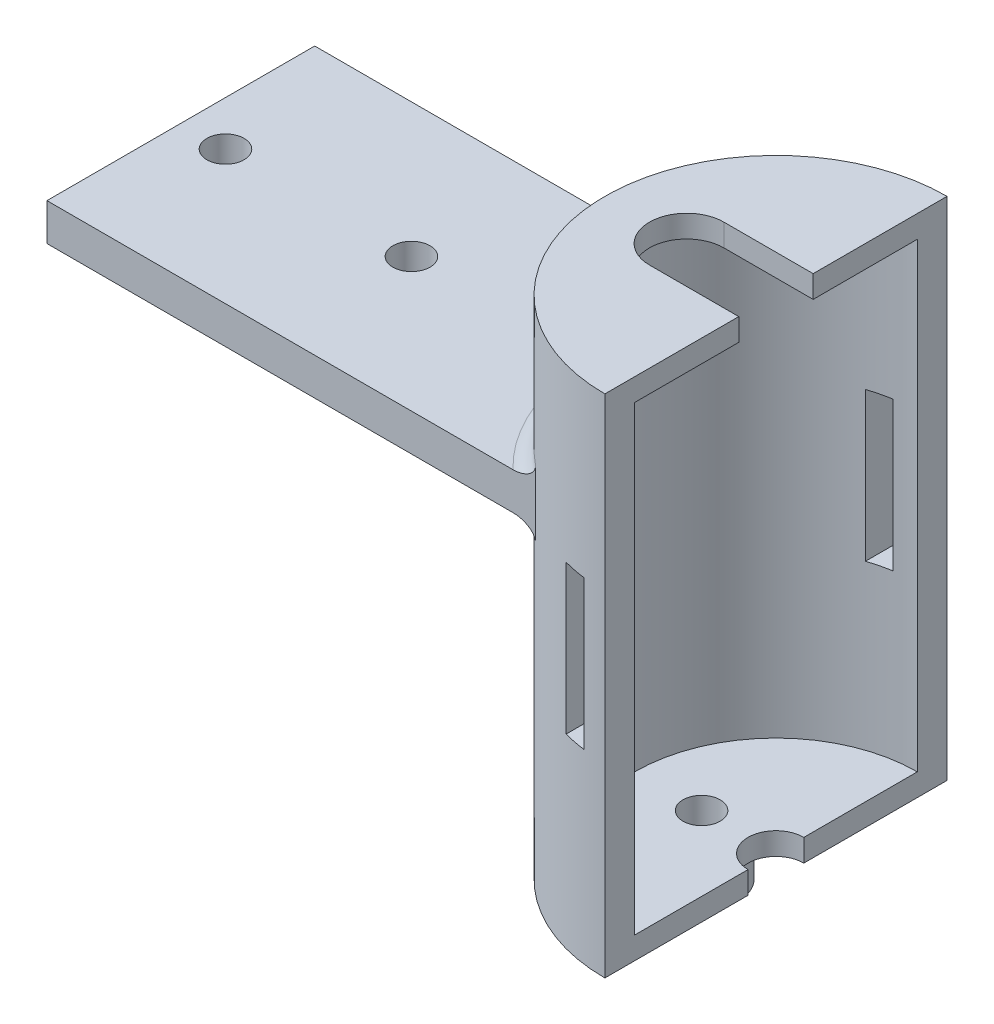
ISO-10303-21;
HEADER;
FILE_DESCRIPTION(('STEP AP214'),'2;1');
FILE_NAME('part.step','',(''),(''),'','','');
FILE_SCHEMA(('AUTOMOTIVE_DESIGN { 1 0 10303 214 1 1 1 1 }'));
ENDSEC;
DATA;
#1=APPLICATION_CONTEXT('core data for automotive mechanical design processes');
#2=APPLICATION_PROTOCOL_DEFINITION('international standard','automotive_design',2000,#1);
#3=PRODUCT_CONTEXT('',#1,'mechanical');
#4=PRODUCT('Part','Part','',(#3));
#5=PRODUCT_RELATED_PRODUCT_CATEGORY('part','',(#4));
#6=PRODUCT_DEFINITION_FORMATION('','',#4);
#7=PRODUCT_DEFINITION_CONTEXT('part definition',#1,'design');
#8=PRODUCT_DEFINITION('design','',#6,#7);
#9=PRODUCT_DEFINITION_SHAPE('','',#8);
#10=(LENGTH_UNIT() NAMED_UNIT(*) SI_UNIT(.MILLI.,.METRE.));
#11=(NAMED_UNIT(*) PLANE_ANGLE_UNIT() SI_UNIT($,.RADIAN.));
#12=(NAMED_UNIT(*) SI_UNIT($,.STERADIAN.) SOLID_ANGLE_UNIT());
#13=UNCERTAINTY_MEASURE_WITH_UNIT(LENGTH_MEASURE(1.E-05),#10,'distance_accuracy_value','');
#14=(GEOMETRIC_REPRESENTATION_CONTEXT(3) GLOBAL_UNCERTAINTY_ASSIGNED_CONTEXT((#13)) GLOBAL_UNIT_ASSIGNED_CONTEXT((#10,
#11,#12)) REPRESENTATION_CONTEXT('',''));
#15=CARTESIAN_POINT('',(0.,0.,0.));
#16=DIRECTION('',(0.,0.,1.));
#17=DIRECTION('',(1.,0.,0.));
#18=AXIS2_PLACEMENT_3D('',#15,#16,#17);
#19=CARTESIAN_POINT('',(0.,62.,0.));
#20=DIRECTION('',(0.,-1.,0.));
#21=DIRECTION('',(0.,0.,-1.));
#22=AXIS2_PLACEMENT_3D('',#19,#20,#21);
#23=CYLINDRICAL_SURFACE('',#22,23.);
#24=DIRECTION('',(0.,-1.,0.));
#25=VECTOR('',#24,1.);
#26=CARTESIAN_POINT('',(0.,62.,-23.));
#27=LINE('',#26,#25);
#28=CARTESIAN_POINT('',(0.,65.,-23.));
#29=VERTEX_POINT('',#28);
#30=CARTESIAN_POINT('',(0.,-3.,-23.));
#31=VERTEX_POINT('',#30);
#32=EDGE_CURVE('E410',#29,#31,#27,.T.);
#33=ORIENTED_EDGE('',*,*,#32,.T.);
#34=CARTESIAN_POINT('',(0.,-3.,0.));
#35=DIRECTION('',(0.,-1.,0.));
#36=DIRECTION('',(0.,0.,-1.));
#37=AXIS2_PLACEMENT_3D('',#34,#35,#36);
#38=CIRCLE('',#37,23.);
#39=CARTESIAN_POINT('',(0.,-3.,23.));
#40=VERTEX_POINT('',#39);
#41=EDGE_CURVE('E453',#40,#31,#38,.T.);
#42=ORIENTED_EDGE('',*,*,#41,.F.);
#43=DIRECTION('',(0.,-1.,0.));
#44=VECTOR('',#43,1.);
#45=CARTESIAN_POINT('',(0.,62.,23.));
#46=LINE('',#45,#44);
#47=CARTESIAN_POINT('',(0.,65.,23.));
#48=VERTEX_POINT('',#47);
#49=EDGE_CURVE('E424',#48,#40,#46,.T.);
#50=ORIENTED_EDGE('',*,*,#49,.F.);
#51=CARTESIAN_POINT('',(0.,65.,0.));
#52=DIRECTION('',(0.,1.,0.));
#53=DIRECTION('',(0.,0.,1.));
#54=AXIS2_PLACEMENT_3D('',#51,#52,#53);
#55=CIRCLE('',#54,23.);
#56=EDGE_CURVE('E262',#29,#48,#55,.T.);
#57=ORIENTED_EDGE('',*,*,#56,.F.);
#58=EDGE_LOOP('',(#33,#42,#50,#57));
#59=FACE_BOUND('',#58,.T.);
#60=CARTESIAN_POINT('',(0.,42.,0.));
#61=DIRECTION('',(0.,1.,0.));
#62=DIRECTION('',(0.,0.,1.));
#63=AXIS2_PLACEMENT_3D('',#60,#61,#62);
#64=CIRCLE('',#63,23.);
#65=CARTESIAN_POINT('',(-3.,42.,-22.8035085019828));
#66=VERTEX_POINT('',#65);
#67=CARTESIAN_POINT('',(-6.00000000000001,42.,-22.2036033111746));
#68=VERTEX_POINT('',#67);
#69=EDGE_CURVE('E474',#66,#68,#64,.T.);
#70=ORIENTED_EDGE('',*,*,#69,.T.);
#71=DIRECTION('',(0.,-1.,0.));
#72=VECTOR('',#71,1.);
#73=CARTESIAN_POINT('',(-6.00000000000001,62.,-22.2036033111746));
#74=LINE('',#73,#72);
#75=CARTESIAN_POINT('',(-5.99999999999998,22.,-22.2036033111746));
#76=VERTEX_POINT('',#75);
#77=EDGE_CURVE('E468',#68,#76,#74,.T.);
#78=ORIENTED_EDGE('',*,*,#77,.T.);
#79=CARTESIAN_POINT('',(0.,22.,0.));
#80=DIRECTION('',(0.,-1.,0.));
#81=DIRECTION('',(0.,0.,-1.));
#82=AXIS2_PLACEMENT_3D('',#79,#80,#81);
#83=CIRCLE('',#82,23.);
#84=CARTESIAN_POINT('',(-3.,22.,-22.8035085019828));
#85=VERTEX_POINT('',#84);
#86=EDGE_CURVE('E485',#76,#85,#83,.T.);
#87=ORIENTED_EDGE('',*,*,#86,.T.);
#88=DIRECTION('',(0.,-1.,0.));
#89=VECTOR('',#88,1.);
#90=CARTESIAN_POINT('',(-3.,62.,-22.8035085019828));
#91=LINE('',#90,#89);
#92=EDGE_CURVE('E481',#85,#66,#91,.F.);
#93=ORIENTED_EDGE('',*,*,#92,.T.);
#94=EDGE_LOOP('',(#70,#78,#87,#93));
#95=FACE_BOUND('',#94,.T.);
#96=CARTESIAN_POINT('',(-3.,22.,22.8035085019828));
#97=VERTEX_POINT('',#96);
#98=CARTESIAN_POINT('',(-5.99999999999998,22.,22.2036033111745));
#99=VERTEX_POINT('',#98);
#100=EDGE_CURVE('E484',#97,#99,#83,.T.);
#101=ORIENTED_EDGE('',*,*,#100,.T.);
#102=DIRECTION('',(0.,-1.,0.));
#103=VECTOR('',#102,1.);
#104=CARTESIAN_POINT('',(-6.00000000000001,62.,22.2036033111745));
#105=LINE('',#104,#103);
#106=CARTESIAN_POINT('',(-6.00000000000001,42.,22.2036033111745));
#107=VERTEX_POINT('',#106);
#108=EDGE_CURVE('E471',#99,#107,#105,.F.);
#109=ORIENTED_EDGE('',*,*,#108,.T.);
#110=CARTESIAN_POINT('',(-3.,42.,22.8035085019828));
#111=VERTEX_POINT('',#110);
#112=EDGE_CURVE('E475',#107,#111,#64,.T.);
#113=ORIENTED_EDGE('',*,*,#112,.T.);
#114=DIRECTION('',(0.,-1.,0.));
#115=VECTOR('',#114,1.);
#116=CARTESIAN_POINT('',(-3.,62.,22.8035085019828));
#117=LINE('',#116,#115);
#118=EDGE_CURVE('E478',#111,#97,#117,.T.);
#119=ORIENTED_EDGE('',*,*,#118,.T.);
#120=EDGE_LOOP('',(#101,#109,#113,#119));
#121=FACE_BOUND('',#120,.T.);
#122=CARTESIAN_POINT('',(0.,38.,0.));
#123=DIRECTION('',(0.,1.,0.));
#124=DIRECTION('',(0.,0.,1.));
#125=AXIS2_PLACEMENT_3D('',#122,#123,#124);
#126=CIRCLE('',#125,23.);
#127=CARTESIAN_POINT('',(-14.3178210632763,38.,18.));
#128=VERTEX_POINT('',#127);
#129=CARTESIAN_POINT('',(-14.3178210632764,38.,-18.0000000000001));
#130=VERTEX_POINT('',#129);
#131=EDGE_CURVE('E284',#128,#130,#126,.F.);
#132=ORIENTED_EDGE('',*,*,#131,.T.);
#133=DIRECTION('',(0.,-1.,0.));
#134=VECTOR('',#133,1.);
#135=CARTESIAN_POINT('',(-14.3178210632764,45.,-18.));
#136=LINE('',#135,#134);
#137=CARTESIAN_POINT('',(-14.3178210632764,47.,-18.));
#138=VERTEX_POINT('',#137);
#139=EDGE_CURVE('E217',#138,#130,#136,.T.);
#140=ORIENTED_EDGE('',*,*,#139,.F.);
#141=CARTESIAN_POINT('',(0.,47.,0.));
#142=DIRECTION('',(0.,1.,0.));
#143=DIRECTION('',(0.,0.,1.));
#144=AXIS2_PLACEMENT_3D('',#141,#142,#143);
#145=CIRCLE('',#144,23.);
#146=CARTESIAN_POINT('',(-14.3178210632763,47.,18.));
#147=VERTEX_POINT('',#146);
#148=EDGE_CURVE('E281',#138,#147,#145,.T.);
#149=ORIENTED_EDGE('',*,*,#148,.T.);
#150=DIRECTION('',(0.,-1.,0.));
#151=VECTOR('',#150,1.);
#152=CARTESIAN_POINT('',(-14.3178210632763,45.,18.));
#153=LINE('',#152,#151);
#154=EDGE_CURVE('E224',#147,#128,#153,.T.);
#155=ORIENTED_EDGE('',*,*,#154,.T.);
#156=EDGE_LOOP('',(#132,#140,#149,#155));
#157=FACE_BOUND('',#156,.T.);
#158=ADVANCED_FACE('F34',(#59,#95,#121,#157),#23,.T.);
#159=CARTESIAN_POINT('',(0.,62.,-23.));
#160=DIRECTION('',(-1.,0.,0.));
#161=DIRECTION('',(0.,0.,1.));
#162=AXIS2_PLACEMENT_3D('',#159,#160,#161);
#163=PLANE('',#162);
#164=DIRECTION('',(0.,0.,-1.));
#165=VECTOR('',#164,1.);
#166=CARTESIAN_POINT('',(0.,65.,23.));
#167=LINE('',#166,#165);
#168=CARTESIAN_POINT('',(0.,65.,-5.));
#169=VERTEX_POINT('',#168);
#170=EDGE_CURVE('E265',#169,#29,#167,.T.);
#171=ORIENTED_EDGE('',*,*,#170,.F.);
#172=DIRECTION('',(0.,1.,0.));
#173=VECTOR('',#172,1.);
#174=CARTESIAN_POINT('',(0.,-8.00099999999998,-5.));
#175=LINE('',#174,#173);
#176=CARTESIAN_POINT('',(0.,62.,-5.));
#177=VERTEX_POINT('',#176);
#178=EDGE_CURVE('E237',#177,#169,#175,.T.);
#179=ORIENTED_EDGE('',*,*,#178,.F.);
#180=DIRECTION('',(0.,0.,-1.));
#181=VECTOR('',#180,1.);
#182=CARTESIAN_POINT('',(0.,62.,23.));
#183=LINE('',#182,#181);
#184=CARTESIAN_POINT('',(0.,62.,-19.));
#185=VERTEX_POINT('',#184);
#186=EDGE_CURVE('E261',#177,#185,#183,.T.);
#187=ORIENTED_EDGE('',*,*,#186,.T.);
#188=DIRECTION('',(0.,-1.,0.));
#189=VECTOR('',#188,1.);
#190=CARTESIAN_POINT('',(0.,62.,-19.0000000000001));
#191=LINE('',#190,#189);
#192=CARTESIAN_POINT('',(0.,0.,-19.));
#193=VERTEX_POINT('',#192);
#194=EDGE_CURVE('E412',#185,#193,#191,.T.);
#195=ORIENTED_EDGE('',*,*,#194,.T.);
#196=DIRECTION('',(0.,0.,1.));
#197=VECTOR('',#196,1.);
#198=CARTESIAN_POINT('',(0.,0.,-3.75));
#199=LINE('',#198,#197);
#200=CARTESIAN_POINT('',(0.,0.,-3.75));
#201=VERTEX_POINT('',#200);
#202=EDGE_CURVE('E429',#193,#201,#199,.T.);
#203=ORIENTED_EDGE('',*,*,#202,.T.);
#204=DIRECTION('',(0.,1.,0.));
#205=VECTOR('',#204,1.);
#206=CARTESIAN_POINT('',(0.,-3.,-3.75));
#207=LINE('',#206,#205);
#208=CARTESIAN_POINT('',(0.,-3.,-3.75));
#209=VERTEX_POINT('',#208);
#210=EDGE_CURVE('E415',#209,#201,#207,.T.);
#211=ORIENTED_EDGE('',*,*,#210,.F.);
#212=DIRECTION('',(0.,0.,1.));
#213=VECTOR('',#212,1.);
#214=CARTESIAN_POINT('',(0.,-3.,-3.75));
#215=LINE('',#214,#213);
#216=EDGE_CURVE('E451',#31,#209,#215,.T.);
#217=ORIENTED_EDGE('',*,*,#216,.F.);
#218=ORIENTED_EDGE('',*,*,#32,.F.);
#219=EDGE_LOOP('',(#171,#179,#187,#195,#203,#211,#217,#218));
#220=FACE_BOUND('',#219,.T.);
#221=ADVANCED_FACE('F313',(#220),#163,.F.);
#222=CARTESIAN_POINT('',(0.,-3.,0.));
#223=DIRECTION('',(0.,-1.,0.));
#224=DIRECTION('',(0.,0.,-1.));
#225=AXIS2_PLACEMENT_3D('',#222,#223,#224);
#226=PLANE('',#225);
#227=ORIENTED_EDGE('',*,*,#41,.T.);
#228=ORIENTED_EDGE('',*,*,#216,.T.);
#229=CARTESIAN_POINT('',(0.,-3.,0.));
#230=DIRECTION('',(0.,1.,0.));
#231=DIRECTION('',(0.,0.,-1.));
#232=AXIS2_PLACEMENT_3D('',#229,#230,#231);
#233=CIRCLE('',#232,3.75);
#234=CARTESIAN_POINT('',(0.,-3.,3.75));
#235=VERTEX_POINT('',#234);
#236=EDGE_CURVE('E448',#209,#235,#233,.T.);
#237=ORIENTED_EDGE('',*,*,#236,.T.);
#238=DIRECTION('',(0.,0.,1.));
#239=VECTOR('',#238,1.);
#240=CARTESIAN_POINT('',(0.,-3.,23.));
#241=LINE('',#240,#239);
#242=EDGE_CURVE('E439',#235,#40,#241,.T.);
#243=ORIENTED_EDGE('',*,*,#242,.T.);
#244=EDGE_LOOP('',(#227,#228,#237,#243));
#245=FACE_BOUND('',#244,.T.);
#246=CARTESIAN_POINT('',(-10.,-3.,0.));
#247=DIRECTION('',(0.,-1.,0.));
#248=DIRECTION('',(0.,0.,-1.));
#249=AXIS2_PLACEMENT_3D('',#246,#247,#248);
#250=CIRCLE('',#249,5.);
#251=CARTESIAN_POINT('',(-10.,-3.,-5.));
#252=VERTEX_POINT('',#251);
#253=EDGE_CURVE('E457',#252,#252,#250,.T.);
#254=ORIENTED_EDGE('',*,*,#253,.F.);
#255=EDGE_LOOP('',(#254));
#256=FACE_BOUND('',#255,.T.);
#257=ADVANCED_FACE('F319',(#245,#256),#226,.T.);
#258=CARTESIAN_POINT('',(0.,62.,0.));
#259=DIRECTION('',(0.,-1.,0.));
#260=DIRECTION('',(0.,0.,-1.));
#261=AXIS2_PLACEMENT_3D('',#258,#259,#260);
#262=CYLINDRICAL_SURFACE('',#261,19.);
#263=CARTESIAN_POINT('',(0.,22.,0.));
#264=DIRECTION('',(0.,-1.,0.));
#265=DIRECTION('',(0.,0.,-1.));
#266=AXIS2_PLACEMENT_3D('',#263,#264,#265);
#267=CIRCLE('',#266,19.);
#268=CARTESIAN_POINT('',(-3.,22.,-18.7616630392938));
#269=VERTEX_POINT('',#268);
#270=CARTESIAN_POINT('',(-5.99999999999998,22.,-18.02775637732));
#271=VERTEX_POINT('',#270);
#272=EDGE_CURVE('E520',#269,#271,#267,.F.);
#273=ORIENTED_EDGE('',*,*,#272,.T.);
#274=DIRECTION('',(0.,-1.,0.));
#275=VECTOR('',#274,1.);
#276=CARTESIAN_POINT('',(-6.00000000000001,62.,-18.02775637732));
#277=LINE('',#276,#275);
#278=CARTESIAN_POINT('',(-6.00000000000001,42.,-18.02775637732));
#279=VERTEX_POINT('',#278);
#280=EDGE_CURVE('E285',#271,#279,#277,.F.);
#281=ORIENTED_EDGE('',*,*,#280,.T.);
#282=CARTESIAN_POINT('',(0.,42.,0.));
#283=DIRECTION('',(0.,1.,0.));
#284=DIRECTION('',(0.,0.,1.));
#285=AXIS2_PLACEMENT_3D('',#282,#283,#284);
#286=CIRCLE('',#285,19.);
#287=CARTESIAN_POINT('',(-3.,42.,-18.7616630392938));
#288=VERTEX_POINT('',#287);
#289=EDGE_CURVE('E508',#279,#288,#286,.F.);
#290=ORIENTED_EDGE('',*,*,#289,.T.);
#291=DIRECTION('',(0.,-1.,0.));
#292=VECTOR('',#291,1.);
#293=CARTESIAN_POINT('',(-3.,62.,-18.7616630392938));
#294=LINE('',#293,#292);
#295=EDGE_CURVE('E516',#288,#269,#294,.T.);
#296=ORIENTED_EDGE('',*,*,#295,.T.);
#297=EDGE_LOOP('',(#273,#281,#290,#296));
#298=FACE_BOUND('',#297,.T.);
#299=CARTESIAN_POINT('',(-3.,42.,18.7616630392937));
#300=VERTEX_POINT('',#299);
#301=CARTESIAN_POINT('',(-6.00000000000001,42.,18.0277563773199));
#302=VERTEX_POINT('',#301);
#303=EDGE_CURVE('E519',#300,#302,#286,.F.);
#304=ORIENTED_EDGE('',*,*,#303,.T.);
#305=DIRECTION('',(0.,-1.,0.));
#306=VECTOR('',#305,1.);
#307=CARTESIAN_POINT('',(-6.00000000000001,62.,18.0277563773199));
#308=LINE('',#307,#306);
#309=CARTESIAN_POINT('',(-5.99999999999998,22.,18.0277563773199));
#310=VERTEX_POINT('',#309);
#311=EDGE_CURVE('E525',#302,#310,#308,.T.);
#312=ORIENTED_EDGE('',*,*,#311,.T.);
#313=CARTESIAN_POINT('',(-3.,22.,18.7616630392937));
#314=VERTEX_POINT('',#313);
#315=EDGE_CURVE('E529',#310,#314,#267,.F.);
#316=ORIENTED_EDGE('',*,*,#315,.T.);
#317=DIRECTION('',(0.,-1.,0.));
#318=VECTOR('',#317,1.);
#319=CARTESIAN_POINT('',(-3.,62.,18.7616630392937));
#320=LINE('',#319,#318);
#321=EDGE_CURVE('E526',#314,#300,#320,.F.);
#322=ORIENTED_EDGE('',*,*,#321,.T.);
#323=EDGE_LOOP('',(#304,#312,#316,#322));
#324=FACE_BOUND('',#323,.T.);
#325=CARTESIAN_POINT('',(0.,0.,0.));
#326=DIRECTION('',(0.,-1.,0.));
#327=DIRECTION('',(0.,0.,1.));
#328=AXIS2_PLACEMENT_3D('',#325,#326,#327);
#329=CIRCLE('',#328,19.);
#330=CARTESIAN_POINT('',(0.,0.,19.));
#331=VERTEX_POINT('',#330);
#332=EDGE_CURVE('E411',#331,#193,#329,.T.);
#333=ORIENTED_EDGE('',*,*,#332,.T.);
#334=ORIENTED_EDGE('',*,*,#194,.F.);
#335=CARTESIAN_POINT('',(0.,62.,0.));
#336=DIRECTION('',(0.,-1.,0.));
#337=DIRECTION('',(0.,0.,1.));
#338=AXIS2_PLACEMENT_3D('',#335,#336,#337);
#339=CIRCLE('',#338,19.);
#340=CARTESIAN_POINT('',(0.,62.,19.));
#341=VERTEX_POINT('',#340);
#342=EDGE_CURVE('E278',#341,#185,#339,.T.);
#343=ORIENTED_EDGE('',*,*,#342,.F.);
#344=DIRECTION('',(0.,-1.,0.));
#345=VECTOR('',#344,1.);
#346=CARTESIAN_POINT('',(0.,62.,19.));
#347=LINE('',#346,#345);
#348=EDGE_CURVE('E405',#341,#331,#347,.T.);
#349=ORIENTED_EDGE('',*,*,#348,.T.);
#350=EDGE_LOOP('',(#333,#334,#343,#349));
#351=FACE_BOUND('',#350,.T.);
#352=ADVANCED_FACE('F315',(#298,#324,#351),#262,.F.);
#353=CARTESIAN_POINT('',(0.,62.,5.));
#354=VERTEX_POINT('',#353);
#355=EDGE_CURVE('E266',#341,#354,#183,.T.);
#356=ORIENTED_EDGE('',*,*,#355,.T.);
#357=DIRECTION('',(0.,-1.,0.));
#358=VECTOR('',#357,1.);
#359=CARTESIAN_POINT('',(0.,-8.00099999999998,5.));
#360=LINE('',#359,#358);
#361=CARTESIAN_POINT('',(0.,65.,5.));
#362=VERTEX_POINT('',#361);
#363=EDGE_CURVE('E239',#362,#354,#360,.T.);
#364=ORIENTED_EDGE('',*,*,#363,.F.);
#365=EDGE_CURVE('E267',#48,#362,#167,.T.);
#366=ORIENTED_EDGE('',*,*,#365,.F.);
#367=ORIENTED_EDGE('',*,*,#49,.T.);
#368=ORIENTED_EDGE('',*,*,#242,.F.);
#369=DIRECTION('',(0.,1.,0.));
#370=VECTOR('',#369,1.);
#371=CARTESIAN_POINT('',(0.,-3.,3.75));
#372=LINE('',#371,#370);
#373=CARTESIAN_POINT('',(0.,0.,3.75));
#374=VERTEX_POINT('',#373);
#375=EDGE_CURVE('E419',#235,#374,#372,.T.);
#376=ORIENTED_EDGE('',*,*,#375,.T.);
#377=DIRECTION('',(0.,0.,1.));
#378=VECTOR('',#377,1.);
#379=CARTESIAN_POINT('',(0.,0.,23.));
#380=LINE('',#379,#378);
#381=EDGE_CURVE('E434',#374,#331,#380,.T.);
#382=ORIENTED_EDGE('',*,*,#381,.T.);
#383=ORIENTED_EDGE('',*,*,#348,.F.);
#384=EDGE_LOOP('',(#356,#364,#366,#367,#368,#376,#382,#383));
#385=FACE_BOUND('',#384,.T.);
#386=ADVANCED_FACE('F318',(#385),#163,.F.);
#387=CARTESIAN_POINT('',(0.,-3.,0.));
#388=DIRECTION('',(0.,1.,0.));
#389=DIRECTION('',(0.,0.,1.));
#390=AXIS2_PLACEMENT_3D('',#387,#388,#389);
#391=CYLINDRICAL_SURFACE('',#390,3.75);
#392=CARTESIAN_POINT('',(0.,0.,0.));
#393=DIRECTION('',(0.,1.,0.));
#394=DIRECTION('',(0.,0.,-1.));
#395=AXIS2_PLACEMENT_3D('',#392,#393,#394);
#396=CIRCLE('',#395,3.75);
#397=EDGE_CURVE('E432',#201,#374,#396,.T.);
#398=ORIENTED_EDGE('',*,*,#397,.T.);
#399=ORIENTED_EDGE('',*,*,#375,.F.);
#400=ORIENTED_EDGE('',*,*,#236,.F.);
#401=ORIENTED_EDGE('',*,*,#210,.T.);
#402=EDGE_LOOP('',(#398,#399,#400,#401));
#403=FACE_BOUND('',#402,.T.);
#404=ADVANCED_FACE('F323',(#403),#391,.F.);
#405=CARTESIAN_POINT('',(0.,0.,0.));
#406=DIRECTION('',(0.,-1.,0.));
#407=DIRECTION('',(0.,0.,-1.));
#408=AXIS2_PLACEMENT_3D('',#405,#406,#407);
#409=PLANE('',#408);
#410=CARTESIAN_POINT('',(-10.,0.,0.));
#411=DIRECTION('',(0.,-1.,0.));
#412=DIRECTION('',(0.,0.,-1.));
#413=AXIS2_PLACEMENT_3D('',#410,#411,#412);
#414=CIRCLE('',#413,2.49999999999999);
#415=CARTESIAN_POINT('',(-10.,0.,-2.49999999999999));
#416=VERTEX_POINT('',#415);
#417=EDGE_CURVE('E460',#416,#416,#414,.T.);
#418=ORIENTED_EDGE('',*,*,#417,.T.);
#419=EDGE_LOOP('',(#418));
#420=FACE_BOUND('',#419,.T.);
#421=ORIENTED_EDGE('',*,*,#332,.F.);
#422=ORIENTED_EDGE('',*,*,#381,.F.);
#423=ORIENTED_EDGE('',*,*,#397,.F.);
#424=ORIENTED_EDGE('',*,*,#202,.F.);
#425=EDGE_LOOP('',(#421,#422,#423,#424));
#426=FACE_BOUND('',#425,.T.);
#427=ADVANCED_FACE('F327',(#420,#426),#409,.F.);
#428=CARTESIAN_POINT('',(-10.,-8.00000000000001,0.));
#429=DIRECTION('',(0.,1.,0.));
#430=DIRECTION('',(0.,0.,1.));
#431=AXIS2_PLACEMENT_3D('',#428,#429,#430);
#432=CYLINDRICAL_SURFACE('',#431,5.);
#433=CARTESIAN_POINT('',(-10.,-8.00000000000001,0.));
#434=DIRECTION('',(0.,-1.,0.));
#435=DIRECTION('',(0.,0.,-1.));
#436=AXIS2_PLACEMENT_3D('',#433,#434,#435);
#437=CIRCLE('',#436,5.);
#438=CARTESIAN_POINT('',(-10.,-8.00000000000001,-5.));
#439=VERTEX_POINT('',#438);
#440=EDGE_CURVE('E433',#439,#439,#437,.T.);
#441=ORIENTED_EDGE('',*,*,#440,.F.);
#442=EDGE_LOOP('',(#441));
#443=FACE_BOUND('',#442,.T.);
#444=ORIENTED_EDGE('',*,*,#253,.T.);
#445=EDGE_LOOP('',(#444));
#446=FACE_BOUND('',#445,.T.);
#447=ADVANCED_FACE('F331',(#443,#446),#432,.T.);
#448=CARTESIAN_POINT('',(-10.,-8.00000000000001,0.));
#449=DIRECTION('',(0.,-1.,0.));
#450=DIRECTION('',(0.,0.,-1.));
#451=AXIS2_PLACEMENT_3D('',#448,#449,#450);
#452=PLANE('',#451);
#453=CARTESIAN_POINT('',(-10.,-8.00000000000001,0.));
#454=DIRECTION('',(0.,-1.,0.));
#455=DIRECTION('',(0.,0.,-1.));
#456=AXIS2_PLACEMENT_3D('',#453,#454,#455);
#457=CIRCLE('',#456,2.49999999999999);
#458=CARTESIAN_POINT('',(-10.,-8.00000000000001,-2.49999999999999));
#459=VERTEX_POINT('',#458);
#460=EDGE_CURVE('E465',#459,#459,#457,.T.);
#461=ORIENTED_EDGE('',*,*,#460,.F.);
#462=EDGE_LOOP('',(#461));
#463=FACE_BOUND('',#462,.T.);
#464=ORIENTED_EDGE('',*,*,#440,.T.);
#465=EDGE_LOOP('',(#464));
#466=FACE_BOUND('',#465,.T.);
#467=ADVANCED_FACE('F338',(#463,#466),#452,.T.);
#468=CARTESIAN_POINT('',(-10.,-8.00000000000001,0.));
#469=DIRECTION('',(0.,-1.,0.));
#470=DIRECTION('',(0.,0.,-1.));
#471=AXIS2_PLACEMENT_3D('',#468,#469,#470);
#472=CYLINDRICAL_SURFACE('',#471,2.49999999999999);
#473=ORIENTED_EDGE('',*,*,#460,.T.);
#474=EDGE_LOOP('',(#473));
#475=FACE_BOUND('',#474,.T.);
#476=ORIENTED_EDGE('',*,*,#417,.F.);
#477=EDGE_LOOP('',(#476));
#478=FACE_BOUND('',#477,.T.);
#479=ADVANCED_FACE('F342',(#475,#478),#472,.F.);
#480=CARTESIAN_POINT('',(-5.99999999999998,22.,-23.0000000000001));
#481=DIRECTION('',(0.,-1.,0.));
#482=DIRECTION('',(0.,0.,-1.));
#483=AXIS2_PLACEMENT_3D('',#480,#481,#482);
#484=PLANE('',#483);
#485=DIRECTION('',(0.,0.,1.));
#486=VECTOR('',#485,1.);
#487=CARTESIAN_POINT('',(-3.,22.,-23.));
#488=LINE('',#487,#486);
#489=EDGE_CURVE('E491',#314,#97,#488,.T.);
#490=ORIENTED_EDGE('',*,*,#489,.F.);
#491=ORIENTED_EDGE('',*,*,#315,.F.);
#492=DIRECTION('',(0.,0.,1.));
#493=VECTOR('',#492,1.);
#494=CARTESIAN_POINT('',(-5.99999999999998,22.,-23.0000000000001));
#495=LINE('',#494,#493);
#496=EDGE_CURVE('E270',#310,#99,#495,.T.);
#497=ORIENTED_EDGE('',*,*,#496,.T.);
#498=ORIENTED_EDGE('',*,*,#100,.F.);
#499=EDGE_LOOP('',(#490,#491,#497,#498));
#500=FACE_BOUND('',#499,.T.);
#501=ADVANCED_FACE('F346',(#500),#484,.F.);
#502=CARTESIAN_POINT('',(-3.,42.,-23.));
#503=DIRECTION('',(1.,0.,0.));
#504=DIRECTION('',(0.,1.,0.));
#505=AXIS2_PLACEMENT_3D('',#502,#503,#504);
#506=PLANE('',#505);
#507=DIRECTION('',(0.,0.,1.));
#508=VECTOR('',#507,1.);
#509=CARTESIAN_POINT('',(-3.,42.,-23.));
#510=LINE('',#509,#508);
#511=EDGE_CURVE('E495',#300,#111,#510,.T.);
#512=ORIENTED_EDGE('',*,*,#511,.F.);
#513=ORIENTED_EDGE('',*,*,#321,.F.);
#514=ORIENTED_EDGE('',*,*,#489,.T.);
#515=ORIENTED_EDGE('',*,*,#118,.F.);
#516=EDGE_LOOP('',(#512,#513,#514,#515));
#517=FACE_BOUND('',#516,.T.);
#518=ADVANCED_FACE('F356',(#517),#506,.F.);
#519=CARTESIAN_POINT('',(-6.00000000000001,42.,-23.0000000000001));
#520=DIRECTION('',(0.,1.,0.));
#521=DIRECTION('',(0.,0.,1.));
#522=AXIS2_PLACEMENT_3D('',#519,#520,#521);
#523=PLANE('',#522);
#524=DIRECTION('',(0.,0.,1.));
#525=VECTOR('',#524,1.);
#526=CARTESIAN_POINT('',(-6.00000000000001,42.,-23.0000000000001));
#527=LINE('',#526,#525);
#528=EDGE_CURVE('E498',#302,#107,#527,.T.);
#529=ORIENTED_EDGE('',*,*,#528,.F.);
#530=ORIENTED_EDGE('',*,*,#303,.F.);
#531=ORIENTED_EDGE('',*,*,#511,.T.);
#532=ORIENTED_EDGE('',*,*,#112,.F.);
#533=EDGE_LOOP('',(#529,#530,#531,#532));
#534=FACE_BOUND('',#533,.T.);
#535=ADVANCED_FACE('F361',(#534),#523,.F.);
#536=CARTESIAN_POINT('',(-6.00000000000001,42.,-23.0000000000001));
#537=DIRECTION('',(-1.,0.,0.));
#538=DIRECTION('',(0.,-1.,0.));
#539=AXIS2_PLACEMENT_3D('',#536,#537,#538);
#540=PLANE('',#539);
#541=ORIENTED_EDGE('',*,*,#496,.F.);
#542=ORIENTED_EDGE('',*,*,#311,.F.);
#543=ORIENTED_EDGE('',*,*,#528,.T.);
#544=ORIENTED_EDGE('',*,*,#108,.F.);
#545=EDGE_LOOP('',(#541,#542,#543,#544));
#546=FACE_BOUND('',#545,.T.);
#547=ADVANCED_FACE('F352',(#546),#540,.F.);
#548=EDGE_CURVE('E488',#68,#279,#527,.T.);
#549=ORIENTED_EDGE('',*,*,#548,.T.);
#550=ORIENTED_EDGE('',*,*,#280,.F.);
#551=EDGE_CURVE('E490',#76,#271,#495,.T.);
#552=ORIENTED_EDGE('',*,*,#551,.F.);
#553=ORIENTED_EDGE('',*,*,#77,.F.);
#554=EDGE_LOOP('',(#549,#550,#552,#553));
#555=FACE_BOUND('',#554,.T.);
#556=ADVANCED_FACE('F348',(#555),#540,.F.);
#557=EDGE_CURVE('E497',#66,#288,#510,.T.);
#558=ORIENTED_EDGE('',*,*,#557,.T.);
#559=ORIENTED_EDGE('',*,*,#289,.F.);
#560=ORIENTED_EDGE('',*,*,#548,.F.);
#561=ORIENTED_EDGE('',*,*,#69,.F.);
#562=EDGE_LOOP('',(#558,#559,#560,#561));
#563=FACE_BOUND('',#562,.T.);
#564=ADVANCED_FACE('F351',(#563),#523,.F.);
#565=EDGE_CURVE('E494',#85,#269,#488,.T.);
#566=ORIENTED_EDGE('',*,*,#565,.T.);
#567=ORIENTED_EDGE('',*,*,#295,.F.);
#568=ORIENTED_EDGE('',*,*,#557,.F.);
#569=ORIENTED_EDGE('',*,*,#92,.F.);
#570=EDGE_LOOP('',(#566,#567,#568,#569));
#571=FACE_BOUND('',#570,.T.);
#572=ADVANCED_FACE('F363',(#571),#506,.F.);
#573=ORIENTED_EDGE('',*,*,#551,.T.);
#574=ORIENTED_EDGE('',*,*,#272,.F.);
#575=ORIENTED_EDGE('',*,*,#565,.F.);
#576=ORIENTED_EDGE('',*,*,#86,.F.);
#577=EDGE_LOOP('',(#573,#574,#575,#576));
#578=FACE_BOUND('',#577,.T.);
#579=ADVANCED_FACE('F358',(#578),#484,.F.);
#580=CARTESIAN_POINT('',(0.,62.,0.));
#581=DIRECTION('',(0.,1.,0.));
#582=DIRECTION('',(0.,0.,1.));
#583=AXIS2_PLACEMENT_3D('',#580,#581,#582);
#584=PLANE('',#583);
#585=ORIENTED_EDGE('',*,*,#186,.F.);
#586=DIRECTION('',(1.,0.,0.));
#587=VECTOR('',#586,1.);
#588=CARTESIAN_POINT('',(0.,62.,-5.));
#589=LINE('',#588,#587);
#590=CARTESIAN_POINT('',(-12.,62.,-5.));
#591=VERTEX_POINT('',#590);
#592=EDGE_CURVE('E258',#591,#177,#589,.T.);
#593=ORIENTED_EDGE('',*,*,#592,.F.);
#594=CARTESIAN_POINT('',(-12.,62.,0.));
#595=DIRECTION('',(0.,1.,0.));
#596=DIRECTION('',(0.,0.,1.));
#597=AXIS2_PLACEMENT_3D('',#594,#595,#596);
#598=CIRCLE('',#597,5.);
#599=CARTESIAN_POINT('',(-12.,62.,5.));
#600=VERTEX_POINT('',#599);
#601=EDGE_CURVE('E241',#600,#591,#598,.F.);
#602=ORIENTED_EDGE('',*,*,#601,.F.);
#603=DIRECTION('',(-1.,0.,0.));
#604=VECTOR('',#603,1.);
#605=CARTESIAN_POINT('',(0.,62.,5.));
#606=LINE('',#605,#604);
#607=EDGE_CURVE('E244',#354,#600,#606,.T.);
#608=ORIENTED_EDGE('',*,*,#607,.F.);
#609=ORIENTED_EDGE('',*,*,#355,.F.);
#610=ORIENTED_EDGE('',*,*,#342,.T.);
#611=EDGE_LOOP('',(#585,#593,#602,#608,#609,#610));
#612=FACE_BOUND('',#611,.T.);
#613=ADVANCED_FACE('F367',(#612),#584,.F.);
#614=CARTESIAN_POINT('',(0.,65.,0.));
#615=DIRECTION('',(0.,1.,0.));
#616=DIRECTION('',(0.,0.,1.));
#617=AXIS2_PLACEMENT_3D('',#614,#615,#616);
#618=PLANE('',#617);
#619=DIRECTION('',(-1.,0.,0.));
#620=VECTOR('',#619,1.);
#621=CARTESIAN_POINT('',(0.,65.,-5.));
#622=LINE('',#621,#620);
#623=CARTESIAN_POINT('',(-12.,65.,-5.));
#624=VERTEX_POINT('',#623);
#625=EDGE_CURVE('E247',#169,#624,#622,.T.);
#626=ORIENTED_EDGE('',*,*,#625,.F.);
#627=ORIENTED_EDGE('',*,*,#170,.T.);
#628=ORIENTED_EDGE('',*,*,#56,.T.);
#629=ORIENTED_EDGE('',*,*,#365,.T.);
#630=DIRECTION('',(1.,0.,0.));
#631=VECTOR('',#630,1.);
#632=CARTESIAN_POINT('',(0.,65.,5.));
#633=LINE('',#632,#631);
#634=CARTESIAN_POINT('',(-12.,65.,5.));
#635=VERTEX_POINT('',#634);
#636=EDGE_CURVE('E252',#635,#362,#633,.T.);
#637=ORIENTED_EDGE('',*,*,#636,.F.);
#638=CARTESIAN_POINT('',(-12.,65.,0.));
#639=DIRECTION('',(0.,1.,0.));
#640=DIRECTION('',(0.,0.,1.));
#641=AXIS2_PLACEMENT_3D('',#638,#639,#640);
#642=CIRCLE('',#641,5.);
#643=EDGE_CURVE('E250',#624,#635,#642,.T.);
#644=ORIENTED_EDGE('',*,*,#643,.F.);
#645=EDGE_LOOP('',(#626,#627,#628,#629,#637,#644));
#646=FACE_BOUND('',#645,.T.);
#647=ADVANCED_FACE('F370',(#646),#618,.T.);
#648=CARTESIAN_POINT('',(0.,-8.00099999999998,-5.));
#649=DIRECTION('',(0.,0.,-1.));
#650=DIRECTION('',(-1.,0.,0.));
#651=AXIS2_PLACEMENT_3D('',#648,#649,#650);
#652=PLANE('',#651);
#653=ORIENTED_EDGE('',*,*,#592,.T.);
#654=ORIENTED_EDGE('',*,*,#178,.T.);
#655=ORIENTED_EDGE('',*,*,#625,.T.);
#656=DIRECTION('',(0.,1.,0.));
#657=VECTOR('',#656,1.);
#658=CARTESIAN_POINT('',(-12.,-8.00099999999998,-5.));
#659=LINE('',#658,#657);
#660=EDGE_CURVE('E254',#591,#624,#659,.T.);
#661=ORIENTED_EDGE('',*,*,#660,.F.);
#662=EDGE_LOOP('',(#653,#654,#655,#661));
#663=FACE_BOUND('',#662,.T.);
#664=ADVANCED_FACE('F374',(#663),#652,.F.);
#665=CARTESIAN_POINT('',(-12.,-8.00099999999998,0.));
#666=DIRECTION('',(0.,1.,0.));
#667=DIRECTION('',(0.,0.,1.));
#668=AXIS2_PLACEMENT_3D('',#665,#666,#667);
#669=CYLINDRICAL_SURFACE('',#668,5.);
#670=ORIENTED_EDGE('',*,*,#601,.T.);
#671=ORIENTED_EDGE('',*,*,#660,.T.);
#672=ORIENTED_EDGE('',*,*,#643,.T.);
#673=DIRECTION('',(0.,1.,0.));
#674=VECTOR('',#673,1.);
#675=CARTESIAN_POINT('',(-12.,-8.00099999999998,5.));
#676=LINE('',#675,#674);
#677=EDGE_CURVE('E255',#600,#635,#676,.T.);
#678=ORIENTED_EDGE('',*,*,#677,.F.);
#679=EDGE_LOOP('',(#670,#671,#672,#678));
#680=FACE_BOUND('',#679,.T.);
#681=ADVANCED_FACE('F378',(#680),#669,.F.);
#682=CARTESIAN_POINT('',(0.,-8.00099999999998,5.));
#683=DIRECTION('',(0.,0.,1.));
#684=DIRECTION('',(1.,0.,0.));
#685=AXIS2_PLACEMENT_3D('',#682,#683,#684);
#686=PLANE('',#685);
#687=ORIENTED_EDGE('',*,*,#607,.T.);
#688=ORIENTED_EDGE('',*,*,#677,.T.);
#689=ORIENTED_EDGE('',*,*,#636,.T.);
#690=ORIENTED_EDGE('',*,*,#363,.T.);
#691=EDGE_LOOP('',(#687,#688,#689,#690));
#692=FACE_BOUND('',#691,.T.);
#693=ADVANCED_FACE('F381',(#692),#686,.F.);
#694=CARTESIAN_POINT('',(0.,45.,0.));
#695=DIRECTION('',(0.,1.,0.));
#696=DIRECTION('',(0.,0.,1.));
#697=AXIS2_PLACEMENT_3D('',#694,#695,#696);
#698=PLANE('',#697);
#699=CARTESIAN_POINT('',(-49.,45.,0.));
#700=DIRECTION('',(0.,1.,0.));
#701=DIRECTION('',(0.,0.,1.));
#702=AXIS2_PLACEMENT_3D('',#699,#700,#701);
#703=CIRCLE('',#702,2.5);
#704=CARTESIAN_POINT('',(-49.,45.,2.5));
#705=VERTEX_POINT('',#704);
#706=EDGE_CURVE('E230',#705,#705,#703,.T.);
#707=ORIENTED_EDGE('',*,*,#706,.F.);
#708=EDGE_LOOP('',(#707));
#709=FACE_BOUND('',#708,.T.);
#710=DIRECTION('',(1.,0.,0.));
#711=VECTOR('',#710,1.);
#712=CARTESIAN_POINT('',(-14.3178210632763,45.,18.));
#713=LINE('',#712,#711);
#714=CARTESIAN_POINT('',(-80.,45.,18.));
#715=VERTEX_POINT('',#714);
#716=CARTESIAN_POINT('',(-17.3493515728975,45.,18.));
#717=VERTEX_POINT('',#716);
#718=EDGE_CURVE('E222',#715,#717,#713,.T.);
#719=ORIENTED_EDGE('',*,*,#718,.T.);
#720=CARTESIAN_POINT('',(0.,45.,0.));
#721=DIRECTION('',(0.,1.,0.));
#722=DIRECTION('',(0.,0.,1.));
#723=AXIS2_PLACEMENT_3D('',#720,#721,#722);
#724=CIRCLE('',#723,25.);
#725=CARTESIAN_POINT('',(-17.3493515728975,45.,-18.));
#726=VERTEX_POINT('',#725);
#727=EDGE_CURVE('E206',#717,#726,#724,.F.);
#728=ORIENTED_EDGE('',*,*,#727,.T.);
#729=DIRECTION('',(-1.,0.,0.));
#730=VECTOR('',#729,1.);
#731=CARTESIAN_POINT('',(-14.3178210632764,45.,-18.));
#732=LINE('',#731,#730);
#733=CARTESIAN_POINT('',(-80.,45.,-18.));
#734=VERTEX_POINT('',#733);
#735=EDGE_CURVE('E199',#726,#734,#732,.T.);
#736=ORIENTED_EDGE('',*,*,#735,.T.);
#737=DIRECTION('',(0.,0.,1.));
#738=VECTOR('',#737,1.);
#739=CARTESIAN_POINT('',(-80.,45.,18.));
#740=LINE('',#739,#738);
#741=EDGE_CURVE('E204',#734,#715,#740,.T.);
#742=ORIENTED_EDGE('',*,*,#741,.T.);
#743=EDGE_LOOP('',(#719,#728,#736,#742));
#744=FACE_BOUND('',#743,.T.);
#745=CARTESIAN_POINT('',(-74.,45.,0.));
#746=DIRECTION('',(0.,1.,0.));
#747=DIRECTION('',(0.,0.,1.));
#748=AXIS2_PLACEMENT_3D('',#745,#746,#747);
#749=CIRCLE('',#748,2.49999999999999);
#750=CARTESIAN_POINT('',(-74.,45.,2.49999999999999));
#751=VERTEX_POINT('',#750);
#752=EDGE_CURVE('E814',#751,#751,#749,.T.);
#753=ORIENTED_EDGE('',*,*,#752,.F.);
#754=EDGE_LOOP('',(#753));
#755=FACE_BOUND('',#754,.T.);
#756=ADVANCED_FACE('F201',(#709,#744,#755),#698,.T.);
#757=CARTESIAN_POINT('',(0.,40.,0.));
#758=DIRECTION('',(0.,1.,0.));
#759=DIRECTION('',(0.,0.,1.));
#760=AXIS2_PLACEMENT_3D('',#757,#758,#759);
#761=PLANE('',#760);
#762=CARTESIAN_POINT('',(-49.,40.,0.));
#763=DIRECTION('',(0.,1.,0.));
#764=DIRECTION('',(0.,0.,1.));
#765=AXIS2_PLACEMENT_3D('',#762,#763,#764);
#766=CIRCLE('',#765,2.5);
#767=CARTESIAN_POINT('',(-49.,40.,2.5));
#768=VERTEX_POINT('',#767);
#769=EDGE_CURVE('E812',#768,#768,#766,.T.);
#770=ORIENTED_EDGE('',*,*,#769,.T.);
#771=EDGE_LOOP('',(#770));
#772=FACE_BOUND('',#771,.T.);
#773=DIRECTION('',(-1.,0.,0.));
#774=VECTOR('',#773,1.);
#775=CARTESIAN_POINT('',(-14.3178210632764,40.,-18.));
#776=LINE('',#775,#774);
#777=CARTESIAN_POINT('',(-17.3493515728975,40.,-18.));
#778=VERTEX_POINT('',#777);
#779=CARTESIAN_POINT('',(-80.,40.,-18.));
#780=VERTEX_POINT('',#779);
#781=EDGE_CURVE('E214',#778,#780,#776,.T.);
#782=ORIENTED_EDGE('',*,*,#781,.F.);
#783=CARTESIAN_POINT('',(0.,40.,0.));
#784=DIRECTION('',(0.,1.,0.));
#785=DIRECTION('',(0.,0.,1.));
#786=AXIS2_PLACEMENT_3D('',#783,#784,#785);
#787=CIRCLE('',#786,25.);
#788=CARTESIAN_POINT('',(-17.3493515728975,40.,18.));
#789=VERTEX_POINT('',#788);
#790=EDGE_CURVE('E288',#778,#789,#787,.T.);
#791=ORIENTED_EDGE('',*,*,#790,.T.);
#792=DIRECTION('',(1.,0.,0.));
#793=VECTOR('',#792,1.);
#794=CARTESIAN_POINT('',(-14.3178210632763,40.,18.));
#795=LINE('',#794,#793);
#796=CARTESIAN_POINT('',(-80.,40.,18.));
#797=VERTEX_POINT('',#796);
#798=EDGE_CURVE('E208',#797,#789,#795,.T.);
#799=ORIENTED_EDGE('',*,*,#798,.F.);
#800=DIRECTION('',(0.,0.,1.));
#801=VECTOR('',#800,1.);
#802=CARTESIAN_POINT('',(-80.,40.,18.));
#803=LINE('',#802,#801);
#804=EDGE_CURVE('E229',#780,#797,#803,.T.);
#805=ORIENTED_EDGE('',*,*,#804,.F.);
#806=EDGE_LOOP('',(#782,#791,#799,#805));
#807=FACE_BOUND('',#806,.T.);
#808=CARTESIAN_POINT('',(-74.,40.,0.));
#809=DIRECTION('',(0.,1.,0.));
#810=DIRECTION('',(0.,0.,1.));
#811=AXIS2_PLACEMENT_3D('',#808,#809,#810);
#812=CIRCLE('',#811,2.49999999999999);
#813=CARTESIAN_POINT('',(-74.,40.,2.49999999999999));
#814=VERTEX_POINT('',#813);
#815=EDGE_CURVE('E818',#814,#814,#812,.T.);
#816=ORIENTED_EDGE('',*,*,#815,.T.);
#817=EDGE_LOOP('',(#816));
#818=FACE_BOUND('',#817,.T.);
#819=ADVANCED_FACE('F388',(#772,#807,#818),#761,.F.);
#820=CARTESIAN_POINT('',(-14.3178210632764,45.,-18.));
#821=DIRECTION('',(0.,0.,1.));
#822=DIRECTION('',(1.,0.,0.));
#823=AXIS2_PLACEMENT_3D('',#820,#821,#822);
#824=PLANE('',#823);
#825=ORIENTED_EDGE('',*,*,#139,.T.);
#826=CARTESIAN_POINT('',(-14.3178210632764,38.,-18.0000000000001));
#827=CARTESIAN_POINT('',(-14.3177993303968,38.0423215720594,-18.));
#828=CARTESIAN_POINT('',(-14.3199781678946,38.0846302512702,-18.));
#829=CARTESIAN_POINT('',(-14.3285681480629,38.1687640273127,-18.));
#830=CARTESIAN_POINT('',(-14.3349739659417,38.2105896652771,-18.));
#831=CARTESIAN_POINT('',(-14.3517518205695,38.2929269666227,-18.));
#832=CARTESIAN_POINT('',(-14.3620769170651,38.3334482498968,-18.));
#833=CARTESIAN_POINT('',(-14.3864136899023,38.4133638492586,-18.));
#834=CARTESIAN_POINT('',(-14.4004262885291,38.4527578806712,-18.));
#835=CARTESIAN_POINT('',(-14.447360238508,38.568470640386,-18.));
#836=CARTESIAN_POINT('',(-14.4852817910715,38.6428011955967,-18.));
#837=CARTESIAN_POINT('',(-14.5718160171957,38.7850820982353,-18.));
#838=CARTESIAN_POINT('',(-14.6204629908553,38.853010954767,-18.));
#839=CARTESIAN_POINT('',(-14.7550731497842,39.0177395766824,-18.));
#840=CARTESIAN_POINT('',(-14.8468214149999,39.1098045295513,-18.));
#841=CARTESIAN_POINT('',(-15.0434545523935,39.2785922837515,-18.));
#842=CARTESIAN_POINT('',(-15.1483690016702,39.3552794992451,-18.));
#843=CARTESIAN_POINT('',(-15.3398990498007,39.4772445994073,-18.));
#844=CARTESIAN_POINT('',(-15.4245944657939,39.5255943182523,-18.));
#845=CARTESIAN_POINT('',(-15.5978477035366,39.614819299455,-18.));
#846=CARTESIAN_POINT('',(-15.6864074710975,39.6556907412215,-18.));
#847=CARTESIAN_POINT('',(-15.9567127341393,39.7677511237188,-18.));
#848=CARTESIAN_POINT('',(-16.1429860615622,39.8283260176253,-18.));
#849=CARTESIAN_POINT('',(-16.4156786827456,39.8961956714851,-18.));
#850=CARTESIAN_POINT('',(-16.4996343835874,39.9143354968804,-18.));
#851=CARTESIAN_POINT('',(-16.668518881924,39.9454588516562,-18.));
#852=CARTESIAN_POINT('',(-16.7534476279581,39.9584426524359,-18.));
#853=CARTESIAN_POINT('',(-16.9233836405292,39.9791784881143,-18.));
#854=CARTESIAN_POINT('',(-17.0083869374493,39.9869634240666,-18.));
#855=CARTESIAN_POINT('',(-17.1787082216126,39.9973700467454,-18.));
#856=CARTESIAN_POINT('',(-17.264026207658,39.9999917531042,-18.));
#857=CARTESIAN_POINT('',(-17.3493515728975,40.,-18.));
#858=B_SPLINE_CURVE_WITH_KNOTS('',3,(#826,#827,#828,#829,#830,#831,#832,#833,#834,#835,#836,
#837,#838,#839,#840,#841,#842,#843,#844,#845,#846,#847,#848,#849,#850,#851,#852,#853,#854,#855,
#856,#857),.UNSPECIFIED.,.F.,.F.,(4,2,2,2,2,2,2,2,2,2,2,2,2,2,2,4),(0.,0.126887885971219,
0.253616233705036,0.378872372259987,0.504159868586959,0.753278934020142,1.00320655124566,
1.39094973352125,1.77958009778228,2.07176520528654,2.36409917351064,2.94910846192949,
3.20669262173273,3.46426322120296,3.72018793308742,3.97611167186532),.UNSPECIFIED.);
#859=EDGE_CURVE('E291',#130,#778,#858,.T.);
#860=ORIENTED_EDGE('',*,*,#859,.T.);
#861=ORIENTED_EDGE('',*,*,#781,.T.);
#862=DIRECTION('',(0.,-1.,0.));
#863=VECTOR('',#862,1.);
#864=CARTESIAN_POINT('',(-80.,45.,-18.));
#865=LINE('',#864,#863);
#866=EDGE_CURVE('E211',#734,#780,#865,.T.);
#867=ORIENTED_EDGE('',*,*,#866,.F.);
#868=ORIENTED_EDGE('',*,*,#735,.F.);
#869=CARTESIAN_POINT('',(-17.3493515728975,45.,-18.));
#870=CARTESIAN_POINT('',(-17.2315771065858,45.0000302263174,-18.));
#871=CARTESIAN_POINT('',(-17.1138147160863,45.0050115067177,-18.));
#872=CARTESIAN_POINT('',(-16.8790052986729,45.0247767105711,-18.));
#873=CARTESIAN_POINT('',(-16.761959032861,45.0395696828298,-18.));
#874=CARTESIAN_POINT('',(-16.5283267626423,45.0790555569771,-18.));
#875=CARTESIAN_POINT('',(-16.411757173625,45.103846349043,-18.));
#876=CARTESIAN_POINT('',(-16.1812857929154,45.1634201995861,-18.));
#877=CARTESIAN_POINT('',(-16.0673826887697,45.1981982255063,-18.));
#878=CARTESIAN_POINT('',(-15.7975077526331,45.2943598681656,-17.9999999999999));
#879=CARTESIAN_POINT('',(-15.6432603653932,45.3608117333936,-18.));
#880=CARTESIAN_POINT('',(-15.4208291071805,45.4769191534214,-18.));
#881=CARTESIAN_POINT('',(-15.3482574055724,45.5183001872122,-18.));
#882=CARTESIAN_POINT('',(-15.2067665916548,45.6068784658975,-18.));
#883=CARTESIAN_POINT('',(-15.13784598412,45.6540733031296,-18.0000000000001));
#884=CARTESIAN_POINT('',(-14.9830371094325,45.7709344995871,-18.0000000000001));
#885=CARTESIAN_POINT('',(-14.8988758176153,45.8429303817631,-18.));
#886=CARTESIAN_POINT('',(-14.7419728609119,45.9985490322687,-18.));
#887=CARTESIAN_POINT('',(-14.6692188938949,46.0821590892286,-18.0000000000001));
#888=CARTESIAN_POINT('',(-14.5555025930128,46.2396258111051,-18.0000000000001));
#889=CARTESIAN_POINT('',(-14.5111036535979,46.3109810495682,-18.));
#890=CARTESIAN_POINT('',(-14.4344366176183,46.4598084926136,-18.));
#891=CARTESIAN_POINT('',(-14.4021317494633,46.5372612741391,-18.));
#892=CARTESIAN_POINT('',(-14.3579076914148,46.6787357222632,-18.));
#893=CARTESIAN_POINT('',(-14.3430281208598,46.7418247650837,-18.));
#894=CARTESIAN_POINT('',(-14.3279849452599,46.8377718832517,-18.));
#895=CARTESIAN_POINT('',(-14.3241828645527,46.8700848467406,-18.));
#896=CARTESIAN_POINT('',(-14.3190975622391,46.934927756425,-18.));
#897=CARTESIAN_POINT('',(-14.3178158799227,46.9674578230528,-18.));
#898=CARTESIAN_POINT('',(-14.3178210632764,47.,-18.));
#899=B_SPLINE_CURVE_WITH_KNOTS('',3,(#869,#870,#871,#872,#873,#874,#875,#876,#877,#878,#879,
#880,#881,#882,#883,#884,#885,#886,#887,#888,#889,#890,#891,#892,#893,#894,#895,#896,#897,#898),
.UNSPECIFIED.,.F.,.F.,(4,2,2,2,2,2,2,2,2,2,2,2,2,2,4),(0.,0.353201358283385,0.706728909307367,
1.0638053629802,1.42070220097277,1.922704276839,2.17310263455317,2.4233976415644,
2.75469312510829,3.08562883132725,3.33685413700333,3.58730927504152,3.78102164649373,
3.87854049823092,3.97611888945669),.UNSPECIFIED.);
#900=EDGE_CURVE('E47',#726,#138,#899,.T.);
#901=ORIENTED_EDGE('',*,*,#900,.T.);
#902=EDGE_LOOP('',(#825,#860,#861,#867,#868,#901));
#903=FACE_BOUND('',#902,.T.);
#904=ADVANCED_FACE('F212',(#903),#824,.F.);
#905=CARTESIAN_POINT('',(-80.,45.,18.));
#906=DIRECTION('',(1.,0.,0.));
#907=DIRECTION('',(0.,0.,-1.));
#908=AXIS2_PLACEMENT_3D('',#905,#906,#907);
#909=PLANE('',#908);
#910=ORIENTED_EDGE('',*,*,#804,.T.);
#911=DIRECTION('',(0.,-1.,0.));
#912=VECTOR('',#911,1.);
#913=CARTESIAN_POINT('',(-80.,45.,18.));
#914=LINE('',#913,#912);
#915=EDGE_CURVE('E218',#715,#797,#914,.T.);
#916=ORIENTED_EDGE('',*,*,#915,.F.);
#917=ORIENTED_EDGE('',*,*,#741,.F.);
#918=ORIENTED_EDGE('',*,*,#866,.T.);
#919=EDGE_LOOP('',(#910,#916,#917,#918));
#920=FACE_BOUND('',#919,.T.);
#921=ADVANCED_FACE('F220',(#920),#909,.F.);
#922=CARTESIAN_POINT('',(-14.3178210632763,45.,18.));
#923=DIRECTION('',(0.,0.,-1.));
#924=DIRECTION('',(-1.,0.,0.));
#925=AXIS2_PLACEMENT_3D('',#922,#923,#924);
#926=PLANE('',#925);
#927=ORIENTED_EDGE('',*,*,#798,.T.);
#928=CARTESIAN_POINT('',(-17.3493515728975,40.,18.));
#929=CARTESIAN_POINT('',(-17.2315771065858,39.9999697736826,18.));
#930=CARTESIAN_POINT('',(-17.1138147160862,39.9949884932823,18.));
#931=CARTESIAN_POINT('',(-16.8790052986728,39.9752232894288,18.));
#932=CARTESIAN_POINT('',(-16.761959032861,39.9604303171702,18.));
#933=CARTESIAN_POINT('',(-16.5283267626423,39.9209444430229,18.));
#934=CARTESIAN_POINT('',(-16.411757173625,39.896153650957,18.));
#935=CARTESIAN_POINT('',(-16.1812857929154,39.8365798004139,18.));
#936=CARTESIAN_POINT('',(-16.0673826887696,39.8018017744937,18.));
#937=CARTESIAN_POINT('',(-15.7975077526331,39.7056401318344,18.));
#938=CARTESIAN_POINT('',(-15.6432603653932,39.6391882666064,18.));
#939=CARTESIAN_POINT('',(-15.4208291071805,39.5230808465785,18.));
#940=CARTESIAN_POINT('',(-15.3482574055724,39.4816998127877,18.));
#941=CARTESIAN_POINT('',(-15.2067665916548,39.3931215341025,18.));
#942=CARTESIAN_POINT('',(-15.13784598412,39.3459266968704,18.));
#943=CARTESIAN_POINT('',(-14.9830371094325,39.229065500413,18.));
#944=CARTESIAN_POINT('',(-14.8988758176153,39.1570696182369,18.));
#945=CARTESIAN_POINT('',(-14.7419728609119,39.0014509677313,18.));
#946=CARTESIAN_POINT('',(-14.6692188938949,38.9178409107714,18.));
#947=CARTESIAN_POINT('',(-14.5555025930128,38.7603741888949,18.));
#948=CARTESIAN_POINT('',(-14.5111036535979,38.6890189504318,18.));
#949=CARTESIAN_POINT('',(-14.4344366176183,38.5401915073864,18.));
#950=CARTESIAN_POINT('',(-14.4021317494633,38.4627387258609,18.));
#951=CARTESIAN_POINT('',(-14.3579076914148,38.3212642777368,18.));
#952=CARTESIAN_POINT('',(-14.3430281208598,38.2581752349163,18.));
#953=CARTESIAN_POINT('',(-14.3279849452599,38.1622281167483,18.));
#954=CARTESIAN_POINT('',(-14.3241828645527,38.1299151532593,18.));
#955=CARTESIAN_POINT('',(-14.3190975622391,38.0650722435749,18.));
#956=CARTESIAN_POINT('',(-14.3178158799227,38.0325421769472,18.));
#957=CARTESIAN_POINT('',(-14.3178210632764,38.,18.));
#958=B_SPLINE_CURVE_WITH_KNOTS('',3,(#928,#929,#930,#931,#932,#933,#934,#935,#936,#937,#938,
#939,#940,#941,#942,#943,#944,#945,#946,#947,#948,#949,#950,#951,#952,#953,#954,#955,#956,#957),
.UNSPECIFIED.,.F.,.F.,(4,2,2,2,2,2,2,2,2,2,2,2,2,2,4),(0.,0.353201358283372,0.706728909307356,
1.06380536298019,1.42070220097275,1.92270427683897,2.17310263455315,2.42339764156437,
2.75469312510825,3.08562883132719,3.33685413700329,3.58730927504151,3.78102164649371,
3.8785404982309,3.97611888945668),.UNSPECIFIED.);
#959=EDGE_CURVE('E297',#789,#128,#958,.T.);
#960=ORIENTED_EDGE('',*,*,#959,.T.);
#961=ORIENTED_EDGE('',*,*,#154,.F.);
#962=CARTESIAN_POINT('',(-14.3178210632763,47.,18.));
#963=CARTESIAN_POINT('',(-14.3177993303968,46.9576784279406,18.));
#964=CARTESIAN_POINT('',(-14.3199781678946,46.9153697487298,18.));
#965=CARTESIAN_POINT('',(-14.3285681480629,46.8312359726872,18.));
#966=CARTESIAN_POINT('',(-14.3349739659417,46.7894103347228,18.));
#967=CARTESIAN_POINT('',(-14.3517518205695,46.7070730333772,18.));
#968=CARTESIAN_POINT('',(-14.3620769170651,46.6665517501032,18.));
#969=CARTESIAN_POINT('',(-14.3864136899023,46.5866361507414,18.));
#970=CARTESIAN_POINT('',(-14.4004262885291,46.5472421193287,18.));
#971=CARTESIAN_POINT('',(-14.447360238508,46.431529359614,18.));
#972=CARTESIAN_POINT('',(-14.4852817910715,46.3571988044032,18.));
#973=CARTESIAN_POINT('',(-14.5718160171957,46.2149179017647,18.));
#974=CARTESIAN_POINT('',(-14.6204629908553,46.146989045233,18.));
#975=CARTESIAN_POINT('',(-14.7550731497842,45.9822604233176,18.));
#976=CARTESIAN_POINT('',(-14.8468214149999,45.8901954704487,18.));
#977=CARTESIAN_POINT('',(-15.0434545523935,45.7214077162485,18.));
#978=CARTESIAN_POINT('',(-15.1483690016701,45.644720500755,18.));
#979=CARTESIAN_POINT('',(-15.3398990498006,45.5227554005928,18.));
#980=CARTESIAN_POINT('',(-15.4245944657938,45.4744056817477,18.));
#981=CARTESIAN_POINT('',(-15.5978477035365,45.385180700545,18.));
#982=CARTESIAN_POINT('',(-15.6864074710975,45.3443092587785,18.));
#983=CARTESIAN_POINT('',(-15.9567127341392,45.2322488762812,18.));
#984=CARTESIAN_POINT('',(-16.1429860615621,45.1716739823747,18.));
#985=CARTESIAN_POINT('',(-16.4156786827456,45.1038043285149,18.));
#986=CARTESIAN_POINT('',(-16.4996343835874,45.0856645031196,18.));
#987=CARTESIAN_POINT('',(-16.6685188819239,45.0545411483438,18.));
#988=CARTESIAN_POINT('',(-16.7534476279581,45.0415573475641,18.));
#989=CARTESIAN_POINT('',(-16.9233836405292,45.0208215118856,18.));
#990=CARTESIAN_POINT('',(-17.0083869374493,45.0130365759334,18.));
#991=CARTESIAN_POINT('',(-17.1787082216126,45.0026299532546,18.));
#992=CARTESIAN_POINT('',(-17.264026207658,45.0000082468958,18.));
#993=CARTESIAN_POINT('',(-17.3493515728975,45.,18.));
#994=B_SPLINE_CURVE_WITH_KNOTS('',3,(#962,#963,#964,#965,#966,#967,#968,#969,#970,#971,#972,
#973,#974,#975,#976,#977,#978,#979,#980,#981,#982,#983,#984,#985,#986,#987,#988,#989,#990,#991,
#992,#993),.UNSPECIFIED.,.F.,.F.,(4,2,2,2,2,2,2,2,2,2,2,2,2,2,2,4),(0.,0.126887885971221,
0.25361623370503,0.378872372259983,0.504159868586961,0.753278934020134,1.00320655124561,
1.39094973352121,1.77958009778222,2.07176520528647,2.36409917351059,2.94910846192946,
3.20669262173269,3.46426322120293,3.72018793308739,3.97611167186529),.UNSPECIFIED.);
#995=EDGE_CURVE('E11',#147,#717,#994,.T.);
#996=ORIENTED_EDGE('',*,*,#995,.T.);
#997=ORIENTED_EDGE('',*,*,#718,.F.);
#998=ORIENTED_EDGE('',*,*,#915,.T.);
#999=EDGE_LOOP('',(#927,#960,#961,#996,#997,#998));
#1000=FACE_BOUND('',#999,.T.);
#1001=ADVANCED_FACE('F560',(#1000),#926,.F.);
#1002=CARTESIAN_POINT('',(-49.,45.,0.));
#1003=DIRECTION('',(0.,-1.,0.));
#1004=DIRECTION('',(0.,0.,-1.));
#1005=AXIS2_PLACEMENT_3D('',#1002,#1003,#1004);
#1006=CYLINDRICAL_SURFACE('',#1005,2.5);
#1007=ORIENTED_EDGE('',*,*,#706,.T.);
#1008=EDGE_LOOP('',(#1007));
#1009=FACE_BOUND('',#1008,.T.);
#1010=ORIENTED_EDGE('',*,*,#769,.F.);
#1011=EDGE_LOOP('',(#1010));
#1012=FACE_BOUND('',#1011,.T.);
#1013=ADVANCED_FACE('F574',(#1009,#1012),#1006,.F.);
#1014=CARTESIAN_POINT('',(-74.,45.,0.));
#1015=DIRECTION('',(0.,-1.,0.));
#1016=DIRECTION('',(0.,0.,-1.));
#1017=AXIS2_PLACEMENT_3D('',#1014,#1015,#1016);
#1018=CYLINDRICAL_SURFACE('',#1017,2.49999999999999);
#1019=ORIENTED_EDGE('',*,*,#752,.T.);
#1020=EDGE_LOOP('',(#1019));
#1021=FACE_BOUND('',#1020,.T.);
#1022=ORIENTED_EDGE('',*,*,#815,.F.);
#1023=EDGE_LOOP('',(#1022));
#1024=FACE_BOUND('',#1023,.T.);
#1025=ADVANCED_FACE('F308',(#1021,#1024),#1018,.F.);
#1026=CARTESIAN_POINT('',(0.,38.,0.));
#1027=DIRECTION('',(0.,1.,0.));
#1028=DIRECTION('',(0.,0.,1.));
#1029=AXIS2_PLACEMENT_3D('',#1026,#1027,#1028);
#1030=TOROIDAL_SURFACE('',#1029,25.,2.);
#1031=ORIENTED_EDGE('',*,*,#959,.F.);
#1032=ORIENTED_EDGE('',*,*,#790,.F.);
#1033=ORIENTED_EDGE('',*,*,#859,.F.);
#1034=ORIENTED_EDGE('',*,*,#131,.F.);
#1035=EDGE_LOOP('',(#1031,#1032,#1033,#1034));
#1036=FACE_BOUND('',#1035,.T.);
#1037=ADVANCED_FACE('F304',(#1036),#1030,.F.);
#1038=CARTESIAN_POINT('',(0.,47.,0.));
#1039=DIRECTION('',(0.,1.,0.));
#1040=DIRECTION('',(0.,0.,1.));
#1041=AXIS2_PLACEMENT_3D('',#1038,#1039,#1040);
#1042=TOROIDAL_SURFACE('',#1041,25.,2.);
#1043=ORIENTED_EDGE('',*,*,#995,.F.);
#1044=ORIENTED_EDGE('',*,*,#148,.F.);
#1045=ORIENTED_EDGE('',*,*,#900,.F.);
#1046=ORIENTED_EDGE('',*,*,#727,.F.);
#1047=EDGE_LOOP('',(#1043,#1044,#1045,#1046));
#1048=FACE_BOUND('',#1047,.T.);
#1049=ADVANCED_FACE('F36',(#1048),#1042,.F.);
#1050=CLOSED_SHELL('',(#158,#221,#257,#352,#386,#404,#427,#447,#467,#479,#501,#518,#535,#547,
#556,#564,#572,#579,#613,#647,#664,#681,#693,#756,#819,#904,#921,#1001,#1013,#1025,#1037,#1049));
#1051=MANIFOLD_SOLID_BREP('B2',#1050);
#1052=ADVANCED_BREP_SHAPE_REPRESENTATION('',(#18,#1051),#14);
#1053=SHAPE_DEFINITION_REPRESENTATION(#9,#1052);
ENDSEC;
END-ISO-10303-21;
